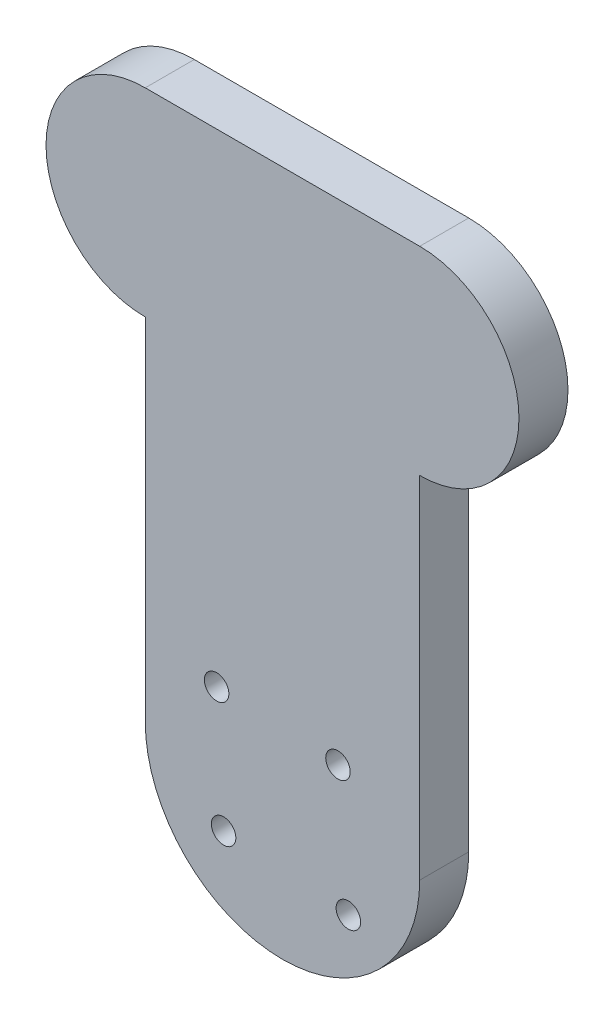
ISO-10303-21;
HEADER;
FILE_DESCRIPTION(('STEP AP214'),'2;1');
FILE_NAME('part.step','',(''),(''),'','','');
FILE_SCHEMA(('AUTOMOTIVE_DESIGN { 1 0 10303 214 1 1 1 1 }'));
ENDSEC;
DATA;
#1=APPLICATION_CONTEXT('core data for automotive mechanical design processes');
#2=APPLICATION_PROTOCOL_DEFINITION('international standard','automotive_design',2000,#1);
#3=PRODUCT_CONTEXT('',#1,'mechanical');
#4=PRODUCT('Part','Part','',(#3));
#5=PRODUCT_RELATED_PRODUCT_CATEGORY('part','',(#4));
#6=PRODUCT_DEFINITION_FORMATION('','',#4);
#7=PRODUCT_DEFINITION_CONTEXT('part definition',#1,'design');
#8=PRODUCT_DEFINITION('design','',#6,#7);
#9=PRODUCT_DEFINITION_SHAPE('','',#8);
#10=(LENGTH_UNIT() NAMED_UNIT(*) SI_UNIT(.MILLI.,.METRE.));
#11=(NAMED_UNIT(*) PLANE_ANGLE_UNIT() SI_UNIT($,.RADIAN.));
#12=(NAMED_UNIT(*) SI_UNIT($,.STERADIAN.) SOLID_ANGLE_UNIT());
#13=UNCERTAINTY_MEASURE_WITH_UNIT(LENGTH_MEASURE(1.E-05),#10,'distance_accuracy_value','');
#14=(GEOMETRIC_REPRESENTATION_CONTEXT(3) GLOBAL_UNCERTAINTY_ASSIGNED_CONTEXT((#13)) GLOBAL_UNIT_ASSIGNED_CONTEXT((#10,
#11,#12)) REPRESENTATION_CONTEXT('',''));
#15=CARTESIAN_POINT('',(0.,0.,0.));
#16=DIRECTION('',(0.,0.,1.));
#17=DIRECTION('',(1.,0.,0.));
#18=AXIS2_PLACEMENT_3D('',#15,#16,#17);
#19=CARTESIAN_POINT('',(14.,45.8766054420111,5.));
#20=DIRECTION('',(0.,0.,1.));
#21=DIRECTION('',(1.,0.,0.));
#22=AXIS2_PLACEMENT_3D('',#19,#20,#21);
#23=PLANE('',#22);
#24=CARTESIAN_POINT('',(5.65999999999993,6.01000000000006,5.));
#25=DIRECTION('',(0.,0.,1.));
#26=DIRECTION('',(-1.,0.,0.));
#27=AXIS2_PLACEMENT_3D('',#24,#25,#26);
#28=CIRCLE('',#27,1.25);
#29=CARTESIAN_POINT('',(4.40999999999993,6.01000000000006,5.));
#30=VERTEX_POINT('',#29);
#31=EDGE_CURVE('E190',#30,#30,#28,.T.);
#32=ORIENTED_EDGE('',*,*,#31,.F.);
#33=EDGE_LOOP('',(#32));
#34=FACE_BOUND('',#33,.T.);
#35=CARTESIAN_POINT('',(6.72,-6.72,5.));
#36=DIRECTION('',(0.,0.,1.));
#37=DIRECTION('',(1.,0.,0.));
#38=AXIS2_PLACEMENT_3D('',#35,#36,#37);
#39=CIRCLE('',#38,1.25);
#40=CARTESIAN_POINT('',(7.97,-6.72,5.));
#41=VERTEX_POINT('',#40);
#42=EDGE_CURVE('E122',#41,#41,#39,.T.);
#43=ORIENTED_EDGE('',*,*,#42,.F.);
#44=EDGE_LOOP('',(#43));
#45=FACE_BOUND('',#44,.T.);
#46=CARTESIAN_POINT('',(14.,45.8766054420111,5.));
#47=DIRECTION('',(0.,0.,1.));
#48=DIRECTION('',(1.,0.,0.));
#49=AXIS2_PLACEMENT_3D('',#46,#47,#48);
#50=CIRCLE('',#49,10.1244475967506);
#51=CARTESIAN_POINT('',(14.,35.7521578452605,5.));
#52=VERTEX_POINT('',#51);
#53=CARTESIAN_POINT('',(14.,56.0010530387617,5.));
#54=VERTEX_POINT('',#53);
#55=EDGE_CURVE('E129',#52,#54,#50,.T.);
#56=ORIENTED_EDGE('',*,*,#55,.T.);
#57=DIRECTION('',(-1.,0.,0.));
#58=VECTOR('',#57,1.);
#59=CARTESIAN_POINT('',(-14.,56.0010530387617,5.));
#60=LINE('',#59,#58);
#61=CARTESIAN_POINT('',(-14.,56.0010530387617,5.));
#62=VERTEX_POINT('',#61);
#63=EDGE_CURVE('E87',#54,#62,#60,.T.);
#64=ORIENTED_EDGE('',*,*,#63,.T.);
#65=CARTESIAN_POINT('',(-14.,45.8766054420111,5.));
#66=DIRECTION('',(0.,0.,1.));
#67=DIRECTION('',(-1.,0.,0.));
#68=AXIS2_PLACEMENT_3D('',#65,#66,#67);
#69=CIRCLE('',#68,10.1244475967506);
#70=CARTESIAN_POINT('',(-14.,35.7521578452605,5.));
#71=VERTEX_POINT('',#70);
#72=EDGE_CURVE('E100',#62,#71,#69,.T.);
#73=ORIENTED_EDGE('',*,*,#72,.T.);
#74=DIRECTION('',(0.,-1.,0.));
#75=VECTOR('',#74,1.);
#76=CARTESIAN_POINT('',(-14.,0.,5.));
#77=LINE('',#76,#75);
#78=CARTESIAN_POINT('',(-14.,0.,5.));
#79=VERTEX_POINT('',#78);
#80=EDGE_CURVE('E94',#71,#79,#77,.T.);
#81=ORIENTED_EDGE('',*,*,#80,.T.);
#82=CARTESIAN_POINT('',(0.,0.,5.));
#83=DIRECTION('',(0.,0.,1.));
#84=DIRECTION('',(1.,0.,0.));
#85=AXIS2_PLACEMENT_3D('',#82,#83,#84);
#86=CIRCLE('',#85,14.);
#87=CARTESIAN_POINT('',(14.,0.,5.));
#88=VERTEX_POINT('',#87);
#89=EDGE_CURVE('E98',#79,#88,#86,.T.);
#90=ORIENTED_EDGE('',*,*,#89,.T.);
#91=DIRECTION('',(0.,1.,0.));
#92=VECTOR('',#91,1.);
#93=CARTESIAN_POINT('',(14.,0.,5.));
#94=LINE('',#93,#92);
#95=EDGE_CURVE('E50',#88,#52,#94,.T.);
#96=ORIENTED_EDGE('',*,*,#95,.T.);
#97=EDGE_LOOP('',(#56,#64,#73,#81,#90,#96));
#98=FACE_BOUND('',#97,.T.);
#99=CARTESIAN_POINT('',(-6.01,-5.66,5.));
#100=DIRECTION('',(0.,0.,1.));
#101=DIRECTION('',(1.,0.,0.));
#102=AXIS2_PLACEMENT_3D('',#99,#100,#101);
#103=CIRCLE('',#102,1.25);
#104=CARTESIAN_POINT('',(-4.76,-5.66,5.));
#105=VERTEX_POINT('',#104);
#106=EDGE_CURVE('E196',#105,#105,#103,.T.);
#107=ORIENTED_EDGE('',*,*,#106,.F.);
#108=EDGE_LOOP('',(#107));
#109=FACE_BOUND('',#108,.T.);
#110=CARTESIAN_POINT('',(-6.71999999999992,6.72000000000008,5.));
#111=DIRECTION('',(0.,0.,1.));
#112=DIRECTION('',(-1.,0.,0.));
#113=AXIS2_PLACEMENT_3D('',#110,#111,#112);
#114=CIRCLE('',#113,1.25);
#115=CARTESIAN_POINT('',(-7.96999999999992,6.72000000000008,5.));
#116=VERTEX_POINT('',#115);
#117=EDGE_CURVE('E181',#116,#116,#114,.T.);
#118=ORIENTED_EDGE('',*,*,#117,.F.);
#119=EDGE_LOOP('',(#118));
#120=FACE_BOUND('',#119,.T.);
#121=ADVANCED_FACE('F33',(#34,#45,#98,#109,#120),#23,.T.);
#122=CARTESIAN_POINT('',(14.,45.8766054420111,0.));
#123=DIRECTION('',(0.,0.,1.));
#124=DIRECTION('',(1.,0.,0.));
#125=AXIS2_PLACEMENT_3D('',#122,#123,#124);
#126=PLANE('',#125);
#127=CARTESIAN_POINT('',(5.65999999999993,6.01000000000006,0.));
#128=DIRECTION('',(0.,0.,1.));
#129=DIRECTION('',(-1.,0.,0.));
#130=AXIS2_PLACEMENT_3D('',#127,#128,#129);
#131=CIRCLE('',#130,1.25);
#132=CARTESIAN_POINT('',(4.40999999999993,6.01000000000006,0.));
#133=VERTEX_POINT('',#132);
#134=EDGE_CURVE('E187',#133,#133,#131,.T.);
#135=ORIENTED_EDGE('',*,*,#134,.T.);
#136=EDGE_LOOP('',(#135));
#137=FACE_BOUND('',#136,.T.);
#138=CARTESIAN_POINT('',(6.72,-6.72,0.));
#139=DIRECTION('',(0.,0.,1.));
#140=DIRECTION('',(1.,0.,0.));
#141=AXIS2_PLACEMENT_3D('',#138,#139,#140);
#142=CIRCLE('',#141,1.25);
#143=CARTESIAN_POINT('',(7.97,-6.72,0.));
#144=VERTEX_POINT('',#143);
#145=EDGE_CURVE('E199',#144,#144,#142,.T.);
#146=ORIENTED_EDGE('',*,*,#145,.T.);
#147=EDGE_LOOP('',(#146));
#148=FACE_BOUND('',#147,.T.);
#149=CARTESIAN_POINT('',(14.,45.8766054420111,0.));
#150=DIRECTION('',(0.,0.,1.));
#151=DIRECTION('',(1.,0.,0.));
#152=AXIS2_PLACEMENT_3D('',#149,#150,#151);
#153=CIRCLE('',#152,10.1244475967506);
#154=CARTESIAN_POINT('',(14.,35.7521578452605,0.));
#155=VERTEX_POINT('',#154);
#156=CARTESIAN_POINT('',(14.,56.0010530387617,0.));
#157=VERTEX_POINT('',#156);
#158=EDGE_CURVE('E118',#155,#157,#153,.T.);
#159=ORIENTED_EDGE('',*,*,#158,.F.);
#160=DIRECTION('',(0.,1.,0.));
#161=VECTOR('',#160,1.);
#162=CARTESIAN_POINT('',(14.,0.,0.));
#163=LINE('',#162,#161);
#164=CARTESIAN_POINT('',(14.,0.,0.));
#165=VERTEX_POINT('',#164);
#166=EDGE_CURVE('E79',#165,#155,#163,.T.);
#167=ORIENTED_EDGE('',*,*,#166,.F.);
#168=CARTESIAN_POINT('',(0.,0.,0.));
#169=DIRECTION('',(0.,0.,1.));
#170=DIRECTION('',(1.,0.,0.));
#171=AXIS2_PLACEMENT_3D('',#168,#169,#170);
#172=CIRCLE('',#171,14.);
#173=CARTESIAN_POINT('',(-14.,0.,0.));
#174=VERTEX_POINT('',#173);
#175=EDGE_CURVE('E73',#174,#165,#172,.T.);
#176=ORIENTED_EDGE('',*,*,#175,.F.);
#177=DIRECTION('',(0.,-1.,0.));
#178=VECTOR('',#177,1.);
#179=CARTESIAN_POINT('',(-14.,0.,0.));
#180=LINE('',#179,#178);
#181=CARTESIAN_POINT('',(-14.,35.7521578452605,0.));
#182=VERTEX_POINT('',#181);
#183=EDGE_CURVE('E108',#182,#174,#180,.T.);
#184=ORIENTED_EDGE('',*,*,#183,.F.);
#185=CARTESIAN_POINT('',(-14.,45.8766054420111,0.));
#186=DIRECTION('',(0.,0.,1.));
#187=DIRECTION('',(-1.,0.,0.));
#188=AXIS2_PLACEMENT_3D('',#185,#186,#187);
#189=CIRCLE('',#188,10.1244475967506);
#190=CARTESIAN_POINT('',(-14.,56.0010530387617,0.));
#191=VERTEX_POINT('',#190);
#192=EDGE_CURVE('E124',#191,#182,#189,.T.);
#193=ORIENTED_EDGE('',*,*,#192,.F.);
#194=DIRECTION('',(-1.,0.,0.));
#195=VECTOR('',#194,1.);
#196=CARTESIAN_POINT('',(-14.,56.0010530387617,0.));
#197=LINE('',#196,#195);
#198=EDGE_CURVE('E121',#157,#191,#197,.T.);
#199=ORIENTED_EDGE('',*,*,#198,.F.);
#200=EDGE_LOOP('',(#159,#167,#176,#184,#193,#199));
#201=FACE_BOUND('',#200,.T.);
#202=CARTESIAN_POINT('',(-6.01,-5.66,0.));
#203=DIRECTION('',(0.,0.,1.));
#204=DIRECTION('',(1.,0.,0.));
#205=AXIS2_PLACEMENT_3D('',#202,#203,#204);
#206=CIRCLE('',#205,1.25);
#207=CARTESIAN_POINT('',(-4.76,-5.66,0.));
#208=VERTEX_POINT('',#207);
#209=EDGE_CURVE('E193',#208,#208,#206,.T.);
#210=ORIENTED_EDGE('',*,*,#209,.T.);
#211=EDGE_LOOP('',(#210));
#212=FACE_BOUND('',#211,.T.);
#213=CARTESIAN_POINT('',(-6.71999999999992,6.72000000000008,0.));
#214=DIRECTION('',(0.,0.,1.));
#215=DIRECTION('',(-1.,0.,0.));
#216=AXIS2_PLACEMENT_3D('',#213,#214,#215);
#217=CIRCLE('',#216,1.25);
#218=CARTESIAN_POINT('',(-7.96999999999992,6.72000000000008,0.));
#219=VERTEX_POINT('',#218);
#220=EDGE_CURVE('E184',#219,#219,#217,.T.);
#221=ORIENTED_EDGE('',*,*,#220,.T.);
#222=EDGE_LOOP('',(#221));
#223=FACE_BOUND('',#222,.T.);
#224=ADVANCED_FACE('F138',(#137,#148,#201,#212,#223),#126,.F.);
#225=CARTESIAN_POINT('',(14.,45.8766054420111,5.));
#226=DIRECTION('',(0.,0.,-1.));
#227=DIRECTION('',(-1.,0.,0.));
#228=AXIS2_PLACEMENT_3D('',#225,#226,#227);
#229=CYLINDRICAL_SURFACE('',#228,10.1244475967506);
#230=ORIENTED_EDGE('',*,*,#158,.T.);
#231=DIRECTION('',(0.,0.,-1.));
#232=VECTOR('',#231,1.);
#233=CARTESIAN_POINT('',(14.,56.0010530387617,5.));
#234=LINE('',#233,#232);
#235=EDGE_CURVE('E11',#54,#157,#234,.T.);
#236=ORIENTED_EDGE('',*,*,#235,.F.);
#237=ORIENTED_EDGE('',*,*,#55,.F.);
#238=DIRECTION('',(0.,0.,-1.));
#239=VECTOR('',#238,1.);
#240=CARTESIAN_POINT('',(14.,35.7521578452605,5.));
#241=LINE('',#240,#239);
#242=EDGE_CURVE('E114',#52,#155,#241,.T.);
#243=ORIENTED_EDGE('',*,*,#242,.T.);
#244=EDGE_LOOP('',(#230,#236,#237,#243));
#245=FACE_BOUND('',#244,.T.);
#246=ADVANCED_FACE('F35',(#245),#229,.T.);
#247=CARTESIAN_POINT('',(-14.,56.0010530387617,5.));
#248=DIRECTION('',(0.,-1.,0.));
#249=DIRECTION('',(0.,0.,-1.));
#250=AXIS2_PLACEMENT_3D('',#247,#248,#249);
#251=PLANE('',#250);
#252=ORIENTED_EDGE('',*,*,#198,.T.);
#253=DIRECTION('',(0.,0.,-1.));
#254=VECTOR('',#253,1.);
#255=CARTESIAN_POINT('',(-14.,56.0010530387617,5.));
#256=LINE('',#255,#254);
#257=EDGE_CURVE('E42',#62,#191,#256,.T.);
#258=ORIENTED_EDGE('',*,*,#257,.F.);
#259=ORIENTED_EDGE('',*,*,#63,.F.);
#260=ORIENTED_EDGE('',*,*,#235,.T.);
#261=EDGE_LOOP('',(#252,#258,#259,#260));
#262=FACE_BOUND('',#261,.T.);
#263=ADVANCED_FACE('F256',(#262),#251,.F.);
#264=CARTESIAN_POINT('',(-14.,45.8766054420111,5.));
#265=DIRECTION('',(0.,0.,-1.));
#266=DIRECTION('',(-1.,0.,0.));
#267=AXIS2_PLACEMENT_3D('',#264,#265,#266);
#268=CYLINDRICAL_SURFACE('',#267,10.1244475967506);
#269=ORIENTED_EDGE('',*,*,#192,.T.);
#270=DIRECTION('',(0.,0.,-1.));
#271=VECTOR('',#270,1.);
#272=CARTESIAN_POINT('',(-14.,35.7521578452605,5.));
#273=LINE('',#272,#271);
#274=EDGE_CURVE('E109',#71,#182,#273,.T.);
#275=ORIENTED_EDGE('',*,*,#274,.F.);
#276=ORIENTED_EDGE('',*,*,#72,.F.);
#277=ORIENTED_EDGE('',*,*,#257,.T.);
#278=EDGE_LOOP('',(#269,#275,#276,#277));
#279=FACE_BOUND('',#278,.T.);
#280=ADVANCED_FACE('F135',(#279),#268,.T.);
#281=CARTESIAN_POINT('',(-14.,0.,5.));
#282=DIRECTION('',(1.,0.,0.));
#283=DIRECTION('',(0.,0.,-1.));
#284=AXIS2_PLACEMENT_3D('',#281,#282,#283);
#285=PLANE('',#284);
#286=ORIENTED_EDGE('',*,*,#183,.T.);
#287=DIRECTION('',(0.,0.,-1.));
#288=VECTOR('',#287,1.);
#289=CARTESIAN_POINT('',(-14.,0.,5.));
#290=LINE('',#289,#288);
#291=EDGE_CURVE('E105',#79,#174,#290,.T.);
#292=ORIENTED_EDGE('',*,*,#291,.F.);
#293=ORIENTED_EDGE('',*,*,#80,.F.);
#294=ORIENTED_EDGE('',*,*,#274,.T.);
#295=EDGE_LOOP('',(#286,#292,#293,#294));
#296=FACE_BOUND('',#295,.T.);
#297=ADVANCED_FACE('F106',(#296),#285,.F.);
#298=CARTESIAN_POINT('',(0.,0.,5.));
#299=DIRECTION('',(0.,0.,-1.));
#300=DIRECTION('',(-1.,0.,0.));
#301=AXIS2_PLACEMENT_3D('',#298,#299,#300);
#302=CYLINDRICAL_SURFACE('',#301,14.);
#303=ORIENTED_EDGE('',*,*,#175,.T.);
#304=DIRECTION('',(0.,0.,-1.));
#305=VECTOR('',#304,1.);
#306=CARTESIAN_POINT('',(14.,0.,5.));
#307=LINE('',#306,#305);
#308=EDGE_CURVE('E110',#88,#165,#307,.T.);
#309=ORIENTED_EDGE('',*,*,#308,.F.);
#310=ORIENTED_EDGE('',*,*,#89,.F.);
#311=ORIENTED_EDGE('',*,*,#291,.T.);
#312=EDGE_LOOP('',(#303,#309,#310,#311));
#313=FACE_BOUND('',#312,.T.);
#314=ADVANCED_FACE('F112',(#313),#302,.T.);
#315=CARTESIAN_POINT('',(14.,0.,5.));
#316=DIRECTION('',(-1.,0.,0.));
#317=DIRECTION('',(0.,0.,1.));
#318=AXIS2_PLACEMENT_3D('',#315,#316,#317);
#319=PLANE('',#318);
#320=ORIENTED_EDGE('',*,*,#166,.T.);
#321=ORIENTED_EDGE('',*,*,#242,.F.);
#322=ORIENTED_EDGE('',*,*,#95,.F.);
#323=ORIENTED_EDGE('',*,*,#308,.T.);
#324=EDGE_LOOP('',(#320,#321,#322,#323));
#325=FACE_BOUND('',#324,.T.);
#326=ADVANCED_FACE('F143',(#325),#319,.F.);
#327=CARTESIAN_POINT('',(6.72,-6.72,5.));
#328=DIRECTION('',(0.,0.,-1.));
#329=DIRECTION('',(-1.,0.,0.));
#330=AXIS2_PLACEMENT_3D('',#327,#328,#329);
#331=CYLINDRICAL_SURFACE('',#330,1.25);
#332=ORIENTED_EDGE('',*,*,#42,.T.);
#333=EDGE_LOOP('',(#332));
#334=FACE_BOUND('',#333,.T.);
#335=ORIENTED_EDGE('',*,*,#145,.F.);
#336=EDGE_LOOP('',(#335));
#337=FACE_BOUND('',#336,.T.);
#338=ADVANCED_FACE('F145',(#334,#337),#331,.F.);
#339=CARTESIAN_POINT('',(-6.01,-5.66,5.));
#340=DIRECTION('',(0.,0.,-1.));
#341=DIRECTION('',(-1.,0.,0.));
#342=AXIS2_PLACEMENT_3D('',#339,#340,#341);
#343=CYLINDRICAL_SURFACE('',#342,1.25);
#344=ORIENTED_EDGE('',*,*,#106,.T.);
#345=EDGE_LOOP('',(#344));
#346=FACE_BOUND('',#345,.T.);
#347=ORIENTED_EDGE('',*,*,#209,.F.);
#348=EDGE_LOOP('',(#347));
#349=FACE_BOUND('',#348,.T.);
#350=ADVANCED_FACE('F151',(#346,#349),#343,.F.);
#351=CARTESIAN_POINT('',(5.65999999999993,6.01000000000006,5.));
#352=DIRECTION('',(0.,0.,-1.));
#353=DIRECTION('',(-1.,0.,0.));
#354=AXIS2_PLACEMENT_3D('',#351,#352,#353);
#355=CYLINDRICAL_SURFACE('',#354,1.25);
#356=ORIENTED_EDGE('',*,*,#31,.T.);
#357=EDGE_LOOP('',(#356));
#358=FACE_BOUND('',#357,.T.);
#359=ORIENTED_EDGE('',*,*,#134,.F.);
#360=EDGE_LOOP('',(#359));
#361=FACE_BOUND('',#360,.T.);
#362=ADVANCED_FACE('F168',(#358,#361),#355,.F.);
#363=CARTESIAN_POINT('',(-6.71999999999992,6.72000000000008,5.));
#364=DIRECTION('',(0.,0.,-1.));
#365=DIRECTION('',(-1.,0.,0.));
#366=AXIS2_PLACEMENT_3D('',#363,#364,#365);
#367=CYLINDRICAL_SURFACE('',#366,1.25);
#368=ORIENTED_EDGE('',*,*,#117,.T.);
#369=EDGE_LOOP('',(#368));
#370=FACE_BOUND('',#369,.T.);
#371=ORIENTED_EDGE('',*,*,#220,.F.);
#372=EDGE_LOOP('',(#371));
#373=FACE_BOUND('',#372,.T.);
#374=ADVANCED_FACE('F172',(#370,#373),#367,.F.);
#375=CLOSED_SHELL('',(#121,#224,#246,#263,#280,#297,#314,#326,#338,#350,#362,#374));
#376=MANIFOLD_SOLID_BREP('B2',#375);
#377=ADVANCED_BREP_SHAPE_REPRESENTATION('',(#18,#376),#14);
#378=SHAPE_DEFINITION_REPRESENTATION(#9,#377);
ENDSEC;
END-ISO-10303-21;
